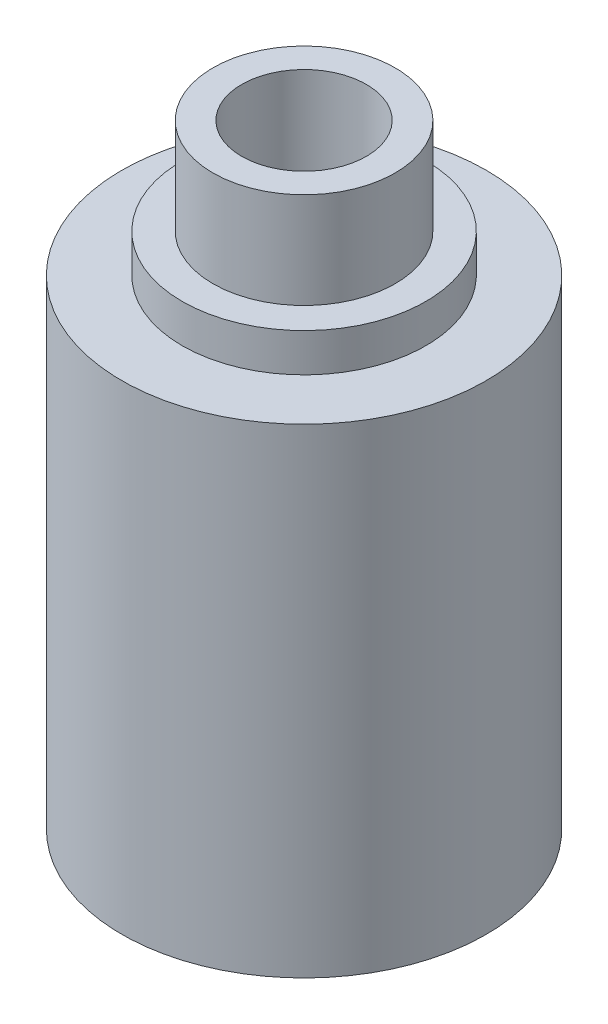
ISO-10303-21;
HEADER;
FILE_DESCRIPTION(('STEP AP214'),'2;1');
FILE_NAME('part.step','',(''),(''),'','','');
FILE_SCHEMA(('AUTOMOTIVE_DESIGN { 1 0 10303 214 1 1 1 1 }'));
ENDSEC;
DATA;
#1=APPLICATION_CONTEXT('core data for automotive mechanical design processes');
#2=APPLICATION_PROTOCOL_DEFINITION('international standard','automotive_design',2000,#1);
#3=PRODUCT_CONTEXT('',#1,'mechanical');
#4=PRODUCT('Part','Part','',(#3));
#5=PRODUCT_RELATED_PRODUCT_CATEGORY('part','',(#4));
#6=PRODUCT_DEFINITION_FORMATION('','',#4);
#7=PRODUCT_DEFINITION_CONTEXT('part definition',#1,'design');
#8=PRODUCT_DEFINITION('design','',#6,#7);
#9=PRODUCT_DEFINITION_SHAPE('','',#8);
#10=(LENGTH_UNIT() NAMED_UNIT(*) SI_UNIT(.MILLI.,.METRE.));
#11=(NAMED_UNIT(*) PLANE_ANGLE_UNIT() SI_UNIT($,.RADIAN.));
#12=(NAMED_UNIT(*) SI_UNIT($,.STERADIAN.) SOLID_ANGLE_UNIT());
#13=UNCERTAINTY_MEASURE_WITH_UNIT(LENGTH_MEASURE(1.E-05),#10,'distance_accuracy_value','');
#14=(GEOMETRIC_REPRESENTATION_CONTEXT(3) GLOBAL_UNCERTAINTY_ASSIGNED_CONTEXT((#13)) GLOBAL_UNIT_ASSIGNED_CONTEXT((#10,
#11,#12)) REPRESENTATION_CONTEXT('',''));
#15=CARTESIAN_POINT('',(0.,0.,0.));
#16=DIRECTION('',(0.,0.,1.));
#17=DIRECTION('',(1.,0.,0.));
#18=AXIS2_PLACEMENT_3D('',#15,#16,#17);
#19=CARTESIAN_POINT('',(0.,2.,0.));
#20=DIRECTION('',(0.,-1.,0.));
#21=DIRECTION('',(0.,0.,-1.));
#22=AXIS2_PLACEMENT_3D('',#19,#20,#21);
#23=CYLINDRICAL_SURFACE('',#22,6.35);
#24=CARTESIAN_POINT('',(0.,2.,0.));
#25=DIRECTION('',(0.,1.,0.));
#26=DIRECTION('',(0.,0.,1.));
#27=AXIS2_PLACEMENT_3D('',#24,#25,#26);
#28=CIRCLE('',#27,6.35);
#29=CARTESIAN_POINT('',(0.,2.,6.35));
#30=VERTEX_POINT('',#29);
#31=EDGE_CURVE('E40',#30,#30,#28,.T.);
#32=ORIENTED_EDGE('',*,*,#31,.F.);
#33=EDGE_LOOP('',(#32));
#34=FACE_BOUND('',#33,.T.);
#35=CARTESIAN_POINT('',(0.,0.,0.));
#36=DIRECTION('',(0.,1.,0.));
#37=DIRECTION('',(0.,0.,1.));
#38=AXIS2_PLACEMENT_3D('',#35,#36,#37);
#39=CIRCLE('',#38,6.35);
#40=CARTESIAN_POINT('',(0.,0.,6.35));
#41=VERTEX_POINT('',#40);
#42=EDGE_CURVE('E36',#41,#41,#39,.T.);
#43=ORIENTED_EDGE('',*,*,#42,.T.);
#44=EDGE_LOOP('',(#43));
#45=FACE_BOUND('',#44,.T.);
#46=ADVANCED_FACE('F33',(#34,#45),#23,.T.);
#47=CARTESIAN_POINT('',(0.,2.,0.));
#48=DIRECTION('',(0.,1.,0.));
#49=DIRECTION('',(0.,0.,1.));
#50=AXIS2_PLACEMENT_3D('',#47,#48,#49);
#51=PLANE('',#50);
#52=CARTESIAN_POINT('',(0.,2.,0.));
#53=DIRECTION('',(0.,1.,0.));
#54=DIRECTION('',(0.,0.,1.));
#55=AXIS2_PLACEMENT_3D('',#52,#53,#54);
#56=CIRCLE('',#55,4.75);
#57=CARTESIAN_POINT('',(0.,2.,4.75));
#58=VERTEX_POINT('',#57);
#59=EDGE_CURVE('E10',#58,#58,#56,.T.);
#60=ORIENTED_EDGE('',*,*,#59,.F.);
#61=EDGE_LOOP('',(#60));
#62=FACE_BOUND('',#61,.T.);
#63=ORIENTED_EDGE('',*,*,#31,.T.);
#64=EDGE_LOOP('',(#63));
#65=FACE_BOUND('',#64,.T.);
#66=ADVANCED_FACE('F87',(#62,#65),#51,.T.);
#67=CARTESIAN_POINT('',(0.,7.,0.));
#68=DIRECTION('',(0.,-1.,0.));
#69=DIRECTION('',(0.,0.,-1.));
#70=AXIS2_PLACEMENT_3D('',#67,#68,#69);
#71=CYLINDRICAL_SURFACE('',#70,4.75);
#72=CARTESIAN_POINT('',(0.,7.,0.));
#73=DIRECTION('',(0.,1.,0.));
#74=DIRECTION('',(0.,0.,1.));
#75=AXIS2_PLACEMENT_3D('',#72,#73,#74);
#76=CIRCLE('',#75,4.75);
#77=CARTESIAN_POINT('',(0.,7.,4.75));
#78=VERTEX_POINT('',#77);
#79=EDGE_CURVE('E45',#78,#78,#76,.T.);
#80=ORIENTED_EDGE('',*,*,#79,.F.);
#81=EDGE_LOOP('',(#80));
#82=FACE_BOUND('',#81,.T.);
#83=ORIENTED_EDGE('',*,*,#59,.T.);
#84=EDGE_LOOP('',(#83));
#85=FACE_BOUND('',#84,.T.);
#86=ADVANCED_FACE('F92',(#82,#85),#71,.T.);
#87=CARTESIAN_POINT('',(0.,7.,0.));
#88=DIRECTION('',(0.,1.,0.));
#89=DIRECTION('',(0.,0.,1.));
#90=AXIS2_PLACEMENT_3D('',#87,#88,#89);
#91=PLANE('',#90);
#92=CARTESIAN_POINT('',(0.,7.,0.));
#93=DIRECTION('',(0.,1.,0.));
#94=DIRECTION('',(0.,0.,1.));
#95=AXIS2_PLACEMENT_3D('',#92,#93,#94);
#96=CIRCLE('',#95,3.25);
#97=CARTESIAN_POINT('',(0.,7.,3.25));
#98=VERTEX_POINT('',#97);
#99=EDGE_CURVE('E50',#98,#98,#96,.T.);
#100=ORIENTED_EDGE('',*,*,#99,.F.);
#101=EDGE_LOOP('',(#100));
#102=FACE_BOUND('',#101,.T.);
#103=ORIENTED_EDGE('',*,*,#79,.T.);
#104=EDGE_LOOP('',(#103));
#105=FACE_BOUND('',#104,.T.);
#106=ADVANCED_FACE('F99',(#102,#105),#91,.T.);
#107=CARTESIAN_POINT('',(0.,0.,0.));
#108=DIRECTION('',(0.,1.,0.));
#109=DIRECTION('',(0.,0.,1.));
#110=AXIS2_PLACEMENT_3D('',#107,#108,#109);
#111=CYLINDRICAL_SURFACE('',#110,3.25);
#112=CARTESIAN_POINT('',(0.,0.,0.));
#113=DIRECTION('',(0.,1.,0.));
#114=DIRECTION('',(0.,0.,1.));
#115=AXIS2_PLACEMENT_3D('',#112,#113,#114);
#116=CIRCLE('',#115,3.25);
#117=CARTESIAN_POINT('',(0.,0.,3.25));
#118=VERTEX_POINT('',#117);
#119=EDGE_CURVE('E49',#118,#118,#116,.T.);
#120=ORIENTED_EDGE('',*,*,#119,.F.);
#121=EDGE_LOOP('',(#120));
#122=FACE_BOUND('',#121,.T.);
#123=ORIENTED_EDGE('',*,*,#99,.T.);
#124=EDGE_LOOP('',(#123));
#125=FACE_BOUND('',#124,.T.);
#126=ADVANCED_FACE('F70',(#122,#125),#111,.F.);
#127=CARTESIAN_POINT('',(0.,0.,0.));
#128=DIRECTION('',(0.,-1.,0.));
#129=DIRECTION('',(0.,0.,-1.));
#130=AXIS2_PLACEMENT_3D('',#127,#128,#129);
#131=PLANE('',#130);
#132=ORIENTED_EDGE('',*,*,#42,.F.);
#133=EDGE_LOOP('',(#132));
#134=FACE_BOUND('',#133,.T.);
#135=CARTESIAN_POINT('',(0.,0.,0.));
#136=DIRECTION('',(0.,-1.,0.));
#137=DIRECTION('',(0.,0.,-1.));
#138=AXIS2_PLACEMENT_3D('',#135,#136,#137);
#139=CIRCLE('',#138,9.5);
#140=CARTESIAN_POINT('',(0.,0.,-9.5));
#141=VERTEX_POINT('',#140);
#142=EDGE_CURVE('E55',#141,#141,#139,.T.);
#143=ORIENTED_EDGE('',*,*,#142,.F.);
#144=EDGE_LOOP('',(#143));
#145=FACE_BOUND('',#144,.T.);
#146=ADVANCED_FACE('F66',(#134,#145),#131,.F.);
#147=CARTESIAN_POINT('',(0.,-25.,0.));
#148=DIRECTION('',(0.,-1.,0.));
#149=DIRECTION('',(0.,0.,-1.));
#150=AXIS2_PLACEMENT_3D('',#147,#148,#149);
#151=PLANE('',#150);
#152=CARTESIAN_POINT('',(0.,-25.,0.));
#153=DIRECTION('',(0.,-1.,0.));
#154=DIRECTION('',(0.,0.,-1.));
#155=AXIS2_PLACEMENT_3D('',#152,#153,#154);
#156=CIRCLE('',#155,9.5);
#157=CARTESIAN_POINT('',(0.,-25.,-9.5));
#158=VERTEX_POINT('',#157);
#159=EDGE_CURVE('E58',#158,#158,#156,.T.);
#160=ORIENTED_EDGE('',*,*,#159,.T.);
#161=EDGE_LOOP('',(#160));
#162=FACE_BOUND('',#161,.T.);
#163=ADVANCED_FACE('F69',(#162),#151,.T.);
#164=CARTESIAN_POINT('',(0.,-25.,0.));
#165=DIRECTION('',(0.,1.,0.));
#166=DIRECTION('',(0.,0.,1.));
#167=AXIS2_PLACEMENT_3D('',#164,#165,#166);
#168=CYLINDRICAL_SURFACE('',#167,9.5);
#169=ORIENTED_EDGE('',*,*,#159,.F.);
#170=EDGE_LOOP('',(#169));
#171=FACE_BOUND('',#170,.T.);
#172=ORIENTED_EDGE('',*,*,#142,.T.);
#173=EDGE_LOOP('',(#172));
#174=FACE_BOUND('',#173,.T.);
#175=ADVANCED_FACE('F75',(#171,#174),#168,.T.);
#176=ORIENTED_EDGE('',*,*,#119,.T.);
#177=EDGE_LOOP('',(#176));
#178=FACE_BOUND('',#177,.T.);
#179=ADVANCED_FACE('F72',(#178),#131,.F.);
#180=CLOSED_SHELL('',(#46,#66,#86,#106,#126,#146,#163,#175,#179));
#181=MANIFOLD_SOLID_BREP('B2',#180);
#182=ADVANCED_BREP_SHAPE_REPRESENTATION('',(#18,#181),#14);
#183=SHAPE_DEFINITION_REPRESENTATION(#9,#182);
ENDSEC;
END-ISO-10303-21;
